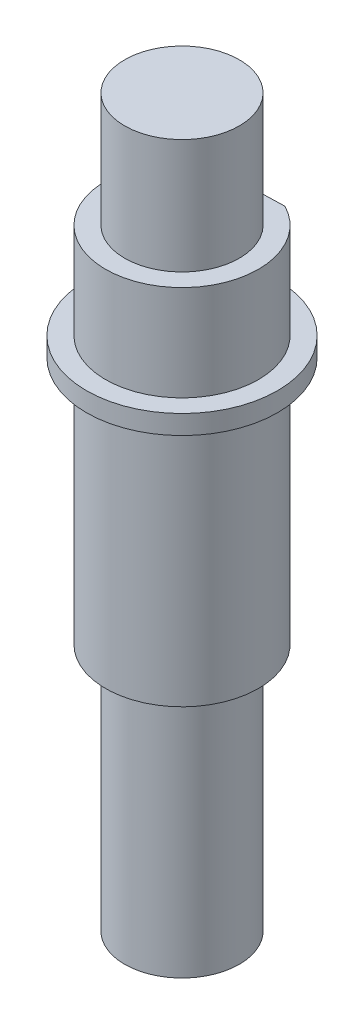
ISO-10303-21;
HEADER;
FILE_DESCRIPTION(('STEP AP214'),'2;1');
FILE_NAME('part.step','',(''),(''),'','','');
FILE_SCHEMA(('AUTOMOTIVE_DESIGN { 1 0 10303 214 1 1 1 1 }'));
ENDSEC;
DATA;
#1=APPLICATION_CONTEXT('core data for automotive mechanical design processes');
#2=APPLICATION_PROTOCOL_DEFINITION('international standard','automotive_design',2000,#1);
#3=PRODUCT_CONTEXT('',#1,'mechanical');
#4=PRODUCT('Part','Part','',(#3));
#5=PRODUCT_RELATED_PRODUCT_CATEGORY('part','',(#4));
#6=PRODUCT_DEFINITION_FORMATION('','',#4);
#7=PRODUCT_DEFINITION_CONTEXT('part definition',#1,'design');
#8=PRODUCT_DEFINITION('design','',#6,#7);
#9=PRODUCT_DEFINITION_SHAPE('','',#8);
#10=(LENGTH_UNIT() NAMED_UNIT(*) SI_UNIT(.MILLI.,.METRE.));
#11=(NAMED_UNIT(*) PLANE_ANGLE_UNIT() SI_UNIT($,.RADIAN.));
#12=(NAMED_UNIT(*) SI_UNIT($,.STERADIAN.) SOLID_ANGLE_UNIT());
#13=UNCERTAINTY_MEASURE_WITH_UNIT(LENGTH_MEASURE(1.E-05),#10,'distance_accuracy_value','');
#14=(GEOMETRIC_REPRESENTATION_CONTEXT(3) GLOBAL_UNCERTAINTY_ASSIGNED_CONTEXT((#13)) GLOBAL_UNIT_ASSIGNED_CONTEXT((#10,
#11,#12)) REPRESENTATION_CONTEXT('',''));
#15=CARTESIAN_POINT('',(0.,0.,0.));
#16=DIRECTION('',(0.,0.,1.));
#17=DIRECTION('',(1.,0.,0.));
#18=AXIS2_PLACEMENT_3D('',#15,#16,#17);
#19=CARTESIAN_POINT('',(0.,6.5,0.));
#20=DIRECTION('',(0.,1.,0.));
#21=DIRECTION('',(0.,0.,1.));
#22=AXIS2_PLACEMENT_3D('',#19,#20,#21);
#23=CYLINDRICAL_SURFACE('',#22,2.);
#24=CARTESIAN_POINT('',(0.,13.,0.));
#25=DIRECTION('',(0.,-1.,0.));
#26=DIRECTION('',(0.,0.,-1.));
#27=AXIS2_PLACEMENT_3D('',#24,#25,#26);
#28=CIRCLE('',#27,2.);
#29=CARTESIAN_POINT('',(0.91192104921424,13.,-1.78));
#30=VERTEX_POINT('',#29);
#31=CARTESIAN_POINT('',(-0.911921049214239,13.,-1.78));
#32=VERTEX_POINT('',#31);
#33=EDGE_CURVE('E64',#30,#32,#28,.T.);
#34=ORIENTED_EDGE('',*,*,#33,.T.);
#35=DIRECTION('',(0.,1.,0.));
#36=VECTOR('',#35,1.);
#37=CARTESIAN_POINT('',(-0.911921049214239,6.5,-1.78));
#38=LINE('',#37,#36);
#39=CARTESIAN_POINT('',(-0.911921049214239,6.5,-1.78));
#40=VERTEX_POINT('',#39);
#41=EDGE_CURVE('E83',#40,#32,#38,.T.);
#42=ORIENTED_EDGE('',*,*,#41,.F.);
#43=CARTESIAN_POINT('',(0.,6.5,0.));
#44=DIRECTION('',(0.,-1.,0.));
#45=DIRECTION('',(0.,0.,-1.));
#46=AXIS2_PLACEMENT_3D('',#43,#44,#45);
#47=CIRCLE('',#46,2.);
#48=CARTESIAN_POINT('',(0.91192104921424,6.5,-1.78));
#49=VERTEX_POINT('',#48);
#50=EDGE_CURVE('E90',#49,#40,#47,.T.);
#51=ORIENTED_EDGE('',*,*,#50,.F.);
#52=DIRECTION('',(0.,1.,0.));
#53=VECTOR('',#52,1.);
#54=CARTESIAN_POINT('',(0.91192104921424,6.5,-1.78));
#55=LINE('',#54,#53);
#56=EDGE_CURVE('E84',#49,#30,#55,.T.);
#57=ORIENTED_EDGE('',*,*,#56,.T.);
#58=EDGE_LOOP('',(#34,#42,#51,#57));
#59=FACE_BOUND('',#58,.T.);
#60=ADVANCED_FACE('F33',(#59),#23,.T.);
#61=CARTESIAN_POINT('',(0.,19.,0.));
#62=DIRECTION('',(0.,-1.,0.));
#63=DIRECTION('',(0.,0.,-1.));
#64=AXIS2_PLACEMENT_3D('',#61,#62,#63);
#65=CYLINDRICAL_SURFACE('',#64,1.5);
#66=CARTESIAN_POINT('',(0.,6.5,0.));
#67=DIRECTION('',(0.,-1.,0.));
#68=DIRECTION('',(0.,0.,-1.));
#69=AXIS2_PLACEMENT_3D('',#66,#67,#68);
#70=CIRCLE('',#69,1.5);
#71=CARTESIAN_POINT('',(0.,6.5,-1.5));
#72=VERTEX_POINT('',#71);
#73=EDGE_CURVE('E86',#72,#72,#70,.T.);
#74=ORIENTED_EDGE('',*,*,#73,.T.);
#75=EDGE_LOOP('',(#74));
#76=FACE_BOUND('',#75,.T.);
#77=CARTESIAN_POINT('',(0.,0.,0.));
#78=DIRECTION('',(0.,1.,0.));
#79=DIRECTION('',(0.,0.,1.));
#80=AXIS2_PLACEMENT_3D('',#77,#78,#79);
#81=CIRCLE('',#80,1.5);
#82=CARTESIAN_POINT('',(0.,0.,1.5));
#83=VERTEX_POINT('',#82);
#84=EDGE_CURVE('E93',#83,#83,#81,.T.);
#85=ORIENTED_EDGE('',*,*,#84,.T.);
#86=EDGE_LOOP('',(#85));
#87=FACE_BOUND('',#86,.T.);
#88=ADVANCED_FACE('F35',(#76,#87),#65,.T.);
#89=CARTESIAN_POINT('',(0.,0.,0.));
#90=DIRECTION('',(0.,1.,0.));
#91=DIRECTION('',(0.,0.,1.));
#92=AXIS2_PLACEMENT_3D('',#89,#90,#91);
#93=PLANE('',#92);
#94=ORIENTED_EDGE('',*,*,#84,.F.);
#95=EDGE_LOOP('',(#94));
#96=FACE_BOUND('',#95,.T.);
#97=ADVANCED_FACE('F117',(#96),#93,.F.);
#98=CARTESIAN_POINT('',(0.,6.5,0.));
#99=DIRECTION('',(0.,-1.,0.));
#100=DIRECTION('',(0.,0.,-1.));
#101=AXIS2_PLACEMENT_3D('',#98,#99,#100);
#102=PLANE('',#101);
#103=ORIENTED_EDGE('',*,*,#50,.T.);
#104=DIRECTION('',(1.,0.,0.));
#105=VECTOR('',#104,1.);
#106=CARTESIAN_POINT('',(-0.911921049214239,6.5,-1.78));
#107=LINE('',#106,#105);
#108=EDGE_CURVE('E54',#40,#49,#107,.T.);
#109=ORIENTED_EDGE('',*,*,#108,.T.);
#110=EDGE_LOOP('',(#103,#109));
#111=FACE_BOUND('',#110,.T.);
#112=ORIENTED_EDGE('',*,*,#73,.F.);
#113=EDGE_LOOP('',(#112));
#114=FACE_BOUND('',#113,.T.);
#115=ADVANCED_FACE('F147',(#111,#114),#102,.T.);
#116=CARTESIAN_POINT('',(-0.911921049214239,6.5,-1.78));
#117=DIRECTION('',(0.,0.,1.));
#118=DIRECTION('',(1.,0.,0.));
#119=AXIS2_PLACEMENT_3D('',#116,#117,#118);
#120=PLANE('',#119);
#121=DIRECTION('',(1.,0.,0.));
#122=VECTOR('',#121,1.);
#123=CARTESIAN_POINT('',(-0.911921049214239,13.,-1.78));
#124=LINE('',#123,#122);
#125=EDGE_CURVE('E85',#32,#30,#124,.T.);
#126=ORIENTED_EDGE('',*,*,#125,.T.);
#127=ORIENTED_EDGE('',*,*,#56,.F.);
#128=ORIENTED_EDGE('',*,*,#108,.F.);
#129=ORIENTED_EDGE('',*,*,#41,.T.);
#130=EDGE_LOOP('',(#126,#127,#128,#129));
#131=FACE_BOUND('',#130,.T.);
#132=ADVANCED_FACE('F92',(#131),#120,.F.);
#133=CARTESIAN_POINT('',(0.,13.5,0.));
#134=DIRECTION('',(0.,1.,0.));
#135=DIRECTION('',(0.,0.,1.));
#136=AXIS2_PLACEMENT_3D('',#133,#134,#135);
#137=PLANE('',#136);
#138=CARTESIAN_POINT('',(0.,13.5,0.));
#139=DIRECTION('',(0.,1.,0.));
#140=DIRECTION('',(0.,0.,1.));
#141=AXIS2_PLACEMENT_3D('',#138,#139,#140);
#142=CIRCLE('',#141,2.5);
#143=CARTESIAN_POINT('',(0.,13.5,2.5));
#144=VERTEX_POINT('',#143);
#145=EDGE_CURVE('E248',#144,#144,#142,.T.);
#146=ORIENTED_EDGE('',*,*,#145,.T.);
#147=EDGE_LOOP('',(#146));
#148=FACE_BOUND('',#147,.T.);
#149=CARTESIAN_POINT('',(0.,13.5,0.));
#150=DIRECTION('',(0.,1.,0.));
#151=DIRECTION('',(0.,0.,1.));
#152=AXIS2_PLACEMENT_3D('',#149,#150,#151);
#153=CIRCLE('',#152,2.);
#154=CARTESIAN_POINT('',(-1.02224970081514,13.5,-1.71901295782881));
#155=VERTEX_POINT('',#154);
#156=CARTESIAN_POINT('',(0.916253010313562,13.5,-1.77777400731683));
#157=VERTEX_POINT('',#156);
#158=EDGE_CURVE('E47',#155,#157,#153,.T.);
#159=ORIENTED_EDGE('',*,*,#158,.F.);
#160=DIRECTION('',(-0.99954088962964,0.,0.0302986791525441));
#161=VECTOR('',#160,1.);
#162=CARTESIAN_POINT('',(0.916253010313562,13.5,-1.77777400731683));
#163=LINE('',#162,#161);
#164=EDGE_CURVE('E11',#157,#155,#163,.T.);
#165=ORIENTED_EDGE('',*,*,#164,.F.);
#166=EDGE_LOOP('',(#159,#165));
#167=FACE_BOUND('',#166,.T.);
#168=ADVANCED_FACE('F172',(#148,#167),#137,.T.);
#169=CARTESIAN_POINT('',(0.,13.,0.));
#170=DIRECTION('',(0.,1.,0.));
#171=DIRECTION('',(0.,0.,1.));
#172=AXIS2_PLACEMENT_3D('',#169,#170,#171);
#173=PLANE('',#172);
#174=CARTESIAN_POINT('',(0.,13.,0.));
#175=DIRECTION('',(0.,1.,0.));
#176=DIRECTION('',(0.,0.,1.));
#177=AXIS2_PLACEMENT_3D('',#174,#175,#176);
#178=CIRCLE('',#177,2.5);
#179=CARTESIAN_POINT('',(0.,13.,2.5));
#180=VERTEX_POINT('',#179);
#181=EDGE_CURVE('E251',#180,#180,#178,.T.);
#182=ORIENTED_EDGE('',*,*,#181,.F.);
#183=EDGE_LOOP('',(#182));
#184=FACE_BOUND('',#183,.T.);
#185=ORIENTED_EDGE('',*,*,#33,.F.);
#186=ORIENTED_EDGE('',*,*,#125,.F.);
#187=EDGE_LOOP('',(#185,#186));
#188=FACE_BOUND('',#187,.T.);
#189=ADVANCED_FACE('F88',(#184,#188),#173,.F.);
#190=CARTESIAN_POINT('',(0.,13.5,0.));
#191=DIRECTION('',(0.,-1.,0.));
#192=DIRECTION('',(0.,0.,-1.));
#193=AXIS2_PLACEMENT_3D('',#190,#191,#192);
#194=CYLINDRICAL_SURFACE('',#193,2.5);
#195=ORIENTED_EDGE('',*,*,#145,.F.);
#196=EDGE_LOOP('',(#195));
#197=FACE_BOUND('',#196,.T.);
#198=ORIENTED_EDGE('',*,*,#181,.T.);
#199=EDGE_LOOP('',(#198));
#200=FACE_BOUND('',#199,.T.);
#201=ADVANCED_FACE('F113',(#197,#200),#194,.T.);
#202=CARTESIAN_POINT('',(0.,19.,0.));
#203=DIRECTION('',(0.,1.,0.));
#204=DIRECTION('',(0.,0.,1.));
#205=AXIS2_PLACEMENT_3D('',#202,#203,#204);
#206=PLANE('',#205);
#207=CARTESIAN_POINT('',(0.,19.,0.));
#208=DIRECTION('',(0.,1.,0.));
#209=DIRECTION('',(0.,0.,1.));
#210=AXIS2_PLACEMENT_3D('',#207,#208,#209);
#211=CIRCLE('',#210,1.5);
#212=CARTESIAN_POINT('',(0.,19.,1.5));
#213=VERTEX_POINT('',#212);
#214=EDGE_CURVE('E41',#213,#213,#211,.T.);
#215=ORIENTED_EDGE('',*,*,#214,.T.);
#216=EDGE_LOOP('',(#215));
#217=FACE_BOUND('',#216,.T.);
#218=ADVANCED_FACE('F101',(#217),#206,.T.);
#219=CARTESIAN_POINT('',(0.,16.,0.));
#220=DIRECTION('',(0.,1.,0.));
#221=DIRECTION('',(0.,0.,1.));
#222=AXIS2_PLACEMENT_3D('',#219,#220,#221);
#223=CIRCLE('',#222,1.5);
#224=CARTESIAN_POINT('',(0.,16.,1.5));
#225=VERTEX_POINT('',#224);
#226=EDGE_CURVE('E256',#225,#225,#223,.T.);
#227=ORIENTED_EDGE('',*,*,#226,.T.);
#228=EDGE_LOOP('',(#227));
#229=FACE_BOUND('',#228,.T.);
#230=ORIENTED_EDGE('',*,*,#214,.F.);
#231=EDGE_LOOP('',(#230));
#232=FACE_BOUND('',#231,.T.);
#233=ADVANCED_FACE('F103',(#229,#232),#65,.T.);
#234=CARTESIAN_POINT('',(0.,16.,0.));
#235=DIRECTION('',(0.,1.,0.));
#236=DIRECTION('',(0.,0.,1.));
#237=AXIS2_PLACEMENT_3D('',#234,#235,#236);
#238=PLANE('',#237);
#239=CARTESIAN_POINT('',(0.,16.,0.));
#240=DIRECTION('',(0.,1.,0.));
#241=DIRECTION('',(0.,0.,1.));
#242=AXIS2_PLACEMENT_3D('',#239,#240,#241);
#243=CIRCLE('',#242,2.);
#244=CARTESIAN_POINT('',(-1.02224970081514,16.,-1.71901295782881));
#245=VERTEX_POINT('',#244);
#246=CARTESIAN_POINT('',(0.916253010313562,16.,-1.77777400731683));
#247=VERTEX_POINT('',#246);
#248=EDGE_CURVE('E137',#245,#247,#243,.T.);
#249=ORIENTED_EDGE('',*,*,#248,.T.);
#250=DIRECTION('',(-0.99954088962964,0.,0.0302986791525441));
#251=VECTOR('',#250,1.);
#252=CARTESIAN_POINT('',(0.916253010313562,16.,-1.77777400731683));
#253=LINE('',#252,#251);
#254=EDGE_CURVE('E71',#247,#245,#253,.T.);
#255=ORIENTED_EDGE('',*,*,#254,.T.);
#256=EDGE_LOOP('',(#249,#255));
#257=FACE_BOUND('',#256,.T.);
#258=ORIENTED_EDGE('',*,*,#226,.F.);
#259=EDGE_LOOP('',(#258));
#260=FACE_BOUND('',#259,.T.);
#261=ADVANCED_FACE('F105',(#257,#260),#238,.T.);
#262=CARTESIAN_POINT('',(0.916253010313562,16.,-1.77777400731683));
#263=DIRECTION('',(0.0302986791525441,0.,0.999540889629639));
#264=DIRECTION('',(0.99954088962964,0.,-0.0302986791525441));
#265=AXIS2_PLACEMENT_3D('',#262,#263,#264);
#266=PLANE('',#265);
#267=DIRECTION('',(0.,-1.,0.));
#268=VECTOR('',#267,1.);
#269=CARTESIAN_POINT('',(0.916253010313562,16.,-1.77777400731683));
#270=LINE('',#269,#268);
#271=EDGE_CURVE('E138',#247,#157,#270,.T.);
#272=ORIENTED_EDGE('',*,*,#271,.T.);
#273=ORIENTED_EDGE('',*,*,#164,.T.);
#274=DIRECTION('',(0.,-1.,0.));
#275=VECTOR('',#274,1.);
#276=CARTESIAN_POINT('',(-1.02224970081514,16.,-1.71901295782881));
#277=LINE('',#276,#275);
#278=EDGE_CURVE('E134',#245,#155,#277,.T.);
#279=ORIENTED_EDGE('',*,*,#278,.F.);
#280=ORIENTED_EDGE('',*,*,#254,.F.);
#281=EDGE_LOOP('',(#272,#273,#279,#280));
#282=FACE_BOUND('',#281,.T.);
#283=ADVANCED_FACE('F111',(#282),#266,.F.);
#284=ORIENTED_EDGE('',*,*,#278,.T.);
#285=ORIENTED_EDGE('',*,*,#158,.T.);
#286=ORIENTED_EDGE('',*,*,#271,.F.);
#287=ORIENTED_EDGE('',*,*,#248,.F.);
#288=EDGE_LOOP('',(#284,#285,#286,#287));
#289=FACE_BOUND('',#288,.T.);
#290=ADVANCED_FACE('F121',(#289),#23,.T.);
#291=CLOSED_SHELL('',(#60,#88,#97,#115,#132,#168,#189,#201,#218,#233,#261,#283,#290));
#292=MANIFOLD_SOLID_BREP('B2',#291);
#293=ADVANCED_BREP_SHAPE_REPRESENTATION('',(#18,#292),#14);
#294=SHAPE_DEFINITION_REPRESENTATION(#9,#293);
ENDSEC;
END-ISO-10303-21;
